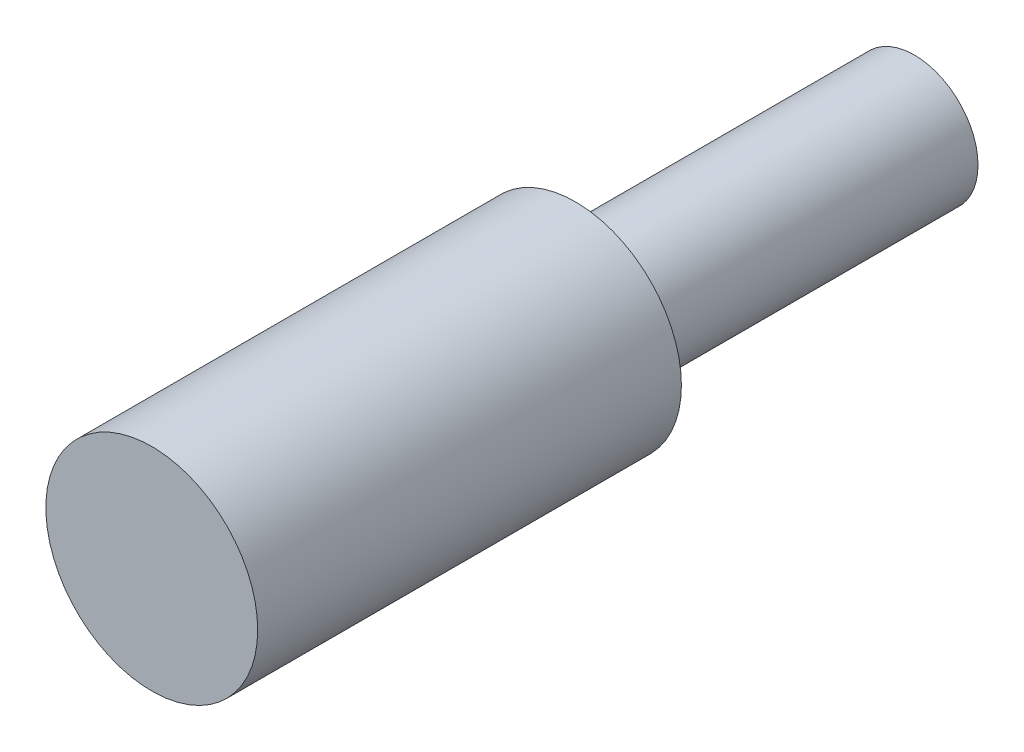
ISO-10303-21;
HEADER;
FILE_DESCRIPTION(('STEP AP214'),'2;1');
FILE_NAME('part.step','',(''),(''),'','','');
FILE_SCHEMA(('AUTOMOTIVE_DESIGN { 1 0 10303 214 1 1 1 1 }'));
ENDSEC;
DATA;
#1=APPLICATION_CONTEXT('core data for automotive mechanical design processes');
#2=APPLICATION_PROTOCOL_DEFINITION('international standard','automotive_design',2000,#1);
#3=PRODUCT_CONTEXT('',#1,'mechanical');
#4=PRODUCT('Part','Part','',(#3));
#5=PRODUCT_RELATED_PRODUCT_CATEGORY('part','',(#4));
#6=PRODUCT_DEFINITION_FORMATION('','',#4);
#7=PRODUCT_DEFINITION_CONTEXT('part definition',#1,'design');
#8=PRODUCT_DEFINITION('design','',#6,#7);
#9=PRODUCT_DEFINITION_SHAPE('','',#8);
#10=(LENGTH_UNIT() NAMED_UNIT(*) SI_UNIT(.MILLI.,.METRE.));
#11=(NAMED_UNIT(*) PLANE_ANGLE_UNIT() SI_UNIT($,.RADIAN.));
#12=(NAMED_UNIT(*) SI_UNIT($,.STERADIAN.) SOLID_ANGLE_UNIT());
#13=UNCERTAINTY_MEASURE_WITH_UNIT(LENGTH_MEASURE(1.E-05),#10,'distance_accuracy_value','');
#14=(GEOMETRIC_REPRESENTATION_CONTEXT(3) GLOBAL_UNCERTAINTY_ASSIGNED_CONTEXT((#13)) GLOBAL_UNIT_ASSIGNED_CONTEXT((#10,
#11,#12)) REPRESENTATION_CONTEXT('',''));
#15=CARTESIAN_POINT('',(0.,0.,0.));
#16=DIRECTION('',(0.,0.,1.));
#17=DIRECTION('',(1.,0.,0.));
#18=AXIS2_PLACEMENT_3D('',#15,#16,#17);
#19=CARTESIAN_POINT('',(0.,0.,100.));
#20=DIRECTION('',(0.,0.,-1.));
#21=DIRECTION('',(-1.,0.,0.));
#22=AXIS2_PLACEMENT_3D('',#19,#20,#21);
#23=CYLINDRICAL_SURFACE('',#22,25.);
#24=CARTESIAN_POINT('',(0.,0.,100.));
#25=DIRECTION('',(0.,0.,1.));
#26=DIRECTION('',(1.,0.,0.));
#27=AXIS2_PLACEMENT_3D('',#24,#25,#26);
#28=CIRCLE('',#27,25.);
#29=CARTESIAN_POINT('',(25.,0.,100.));
#30=VERTEX_POINT('',#29);
#31=EDGE_CURVE('E11',#30,#30,#28,.T.);
#32=ORIENTED_EDGE('',*,*,#31,.F.);
#33=EDGE_LOOP('',(#32));
#34=FACE_BOUND('',#33,.T.);
#35=CARTESIAN_POINT('',(0.,0.,0.));
#36=DIRECTION('',(0.,0.,1.));
#37=DIRECTION('',(1.,0.,0.));
#38=AXIS2_PLACEMENT_3D('',#35,#36,#37);
#39=CIRCLE('',#38,25.);
#40=CARTESIAN_POINT('',(25.,0.,0.));
#41=VERTEX_POINT('',#40);
#42=EDGE_CURVE('E43',#41,#41,#39,.T.);
#43=ORIENTED_EDGE('',*,*,#42,.T.);
#44=EDGE_LOOP('',(#43));
#45=FACE_BOUND('',#44,.T.);
#46=ADVANCED_FACE('F37',(#34,#45),#23,.T.);
#47=CARTESIAN_POINT('',(0.,0.,100.));
#48=DIRECTION('',(0.,0.,1.));
#49=DIRECTION('',(1.,0.,0.));
#50=AXIS2_PLACEMENT_3D('',#47,#48,#49);
#51=PLANE('',#50);
#52=ORIENTED_EDGE('',*,*,#31,.T.);
#53=EDGE_LOOP('',(#52));
#54=FACE_BOUND('',#53,.T.);
#55=ADVANCED_FACE('F137',(#54),#51,.T.);
#56=CARTESIAN_POINT('',(0.,0.,0.));
#57=DIRECTION('',(0.,0.,1.));
#58=DIRECTION('',(1.,0.,0.));
#59=AXIS2_PLACEMENT_3D('',#56,#57,#58);
#60=PLANE('',#59);
#61=CARTESIAN_POINT('',(0.,0.,0.));
#62=DIRECTION('',(0.,0.,1.));
#63=DIRECTION('',(1.,0.,0.));
#64=AXIS2_PLACEMENT_3D('',#61,#62,#63);
#65=CIRCLE('',#64,15.);
#66=CARTESIAN_POINT('',(15.,0.,0.));
#67=VERTEX_POINT('',#66);
#68=EDGE_CURVE('E119',#67,#67,#65,.T.);
#69=ORIENTED_EDGE('',*,*,#68,.T.);
#70=EDGE_LOOP('',(#69));
#71=FACE_BOUND('',#70,.T.);
#72=ORIENTED_EDGE('',*,*,#42,.F.);
#73=EDGE_LOOP('',(#72));
#74=FACE_BOUND('',#73,.T.);
#75=ADVANCED_FACE('F123',(#71,#74),#60,.F.);
#76=CARTESIAN_POINT('',(0.,0.,-80.));
#77=DIRECTION('',(0.,0.,1.));
#78=DIRECTION('',(1.,0.,0.));
#79=AXIS2_PLACEMENT_3D('',#76,#77,#78);
#80=CYLINDRICAL_SURFACE('',#79,15.);
#81=CARTESIAN_POINT('',(0.,0.,-80.));
#82=DIRECTION('',(0.,0.,1.));
#83=DIRECTION('',(1.,0.,0.));
#84=AXIS2_PLACEMENT_3D('',#81,#82,#83);
#85=CIRCLE('',#84,15.);
#86=CARTESIAN_POINT('',(15.,0.,-80.));
#87=VERTEX_POINT('',#86);
#88=EDGE_CURVE('E117',#87,#87,#85,.T.);
#89=ORIENTED_EDGE('',*,*,#88,.T.);
#90=EDGE_LOOP('',(#89));
#91=FACE_BOUND('',#90,.T.);
#92=ORIENTED_EDGE('',*,*,#68,.F.);
#93=EDGE_LOOP('',(#92));
#94=FACE_BOUND('',#93,.T.);
#95=ADVANCED_FACE('F130',(#91,#94),#80,.T.);
#96=CARTESIAN_POINT('',(0.,0.,-80.));
#97=DIRECTION('',(0.,0.,1.));
#98=DIRECTION('',(1.,0.,0.));
#99=AXIS2_PLACEMENT_3D('',#96,#97,#98);
#100=PLANE('',#99);
#101=ORIENTED_EDGE('',*,*,#88,.F.);
#102=EDGE_LOOP('',(#101));
#103=FACE_BOUND('',#102,.T.);
#104=ADVANCED_FACE('F129',(#103),#100,.F.);
#105=CLOSED_SHELL('',(#46,#55,#75,#95,#104));
#106=CARTESIAN_POINT('',(-4.,4.,50.));
#107=DIRECTION('',(1.,0.,0.));
#108=DIRECTION('',(0.,0.,-1.));
#109=AXIS2_PLACEMENT_3D('',#106,#107,#108);
#110=PLANE('',#109);
#111=DIRECTION('',(0.,0.,1.));
#112=VECTOR('',#111,1.);
#113=CARTESIAN_POINT('',(-4.,0.,50.));
#114=LINE('',#113,#112);
#115=CARTESIAN_POINT('',(-4.,0.,20.));
#116=VERTEX_POINT('',#115);
#117=CARTESIAN_POINT('',(-4.,0.,50.));
#118=VERTEX_POINT('',#117);
#119=EDGE_CURVE('E107',#116,#118,#114,.T.);
#120=ORIENTED_EDGE('',*,*,#119,.F.);
#121=DIRECTION('',(0.,-1.,0.));
#122=VECTOR('',#121,1.);
#123=CARTESIAN_POINT('',(-4.,4.,20.));
#124=LINE('',#123,#122);
#125=CARTESIAN_POINT('',(-4.,4.,20.));
#126=VERTEX_POINT('',#125);
#127=EDGE_CURVE('E102',#126,#116,#124,.T.);
#128=ORIENTED_EDGE('',*,*,#127,.F.);
#129=DIRECTION('',(0.,0.,1.));
#130=VECTOR('',#129,1.);
#131=CARTESIAN_POINT('',(-4.,4.,50.));
#132=LINE('',#131,#130);
#133=CARTESIAN_POINT('',(-4.,4.,50.));
#134=VERTEX_POINT('',#133);
#135=EDGE_CURVE('E96',#126,#134,#132,.T.);
#136=ORIENTED_EDGE('',*,*,#135,.T.);
#137=DIRECTION('',(0.,-1.,0.));
#138=VECTOR('',#137,1.);
#139=CARTESIAN_POINT('',(-4.,4.,50.));
#140=LINE('',#139,#138);
#141=EDGE_CURVE('E94',#134,#118,#140,.T.);
#142=ORIENTED_EDGE('',*,*,#141,.T.);
#143=EDGE_LOOP('',(#120,#128,#136,#142));
#144=FACE_BOUND('',#143,.T.);
#145=ADVANCED_FACE('F175',(#144),#110,.T.);
#146=CARTESIAN_POINT('',(-4.,4.,50.));
#147=DIRECTION('',(0.,0.,-1.));
#148=DIRECTION('',(-1.,0.,0.));
#149=AXIS2_PLACEMENT_3D('',#146,#147,#148);
#150=PLANE('',#149);
#151=DIRECTION('',(1.,0.,0.));
#152=VECTOR('',#151,1.);
#153=CARTESIAN_POINT('',(-4.,0.,50.));
#154=LINE('',#153,#152);
#155=CARTESIAN_POINT('',(4.,0.,50.));
#156=VERTEX_POINT('',#155);
#157=EDGE_CURVE('E109',#118,#156,#154,.T.);
#158=ORIENTED_EDGE('',*,*,#157,.F.);
#159=ORIENTED_EDGE('',*,*,#141,.F.);
#160=DIRECTION('',(1.,0.,0.));
#161=VECTOR('',#160,1.);
#162=CARTESIAN_POINT('',(-4.,4.,50.));
#163=LINE('',#162,#161);
#164=CARTESIAN_POINT('',(4.,4.,50.));
#165=VERTEX_POINT('',#164);
#166=EDGE_CURVE('E84',#134,#165,#163,.T.);
#167=ORIENTED_EDGE('',*,*,#166,.T.);
#168=DIRECTION('',(0.,-1.,0.));
#169=VECTOR('',#168,1.);
#170=CARTESIAN_POINT('',(4.,4.,50.));
#171=LINE('',#170,#169);
#172=EDGE_CURVE('E95',#165,#156,#171,.T.);
#173=ORIENTED_EDGE('',*,*,#172,.T.);
#174=EDGE_LOOP('',(#158,#159,#167,#173));
#175=FACE_BOUND('',#174,.T.);
#176=ADVANCED_FACE('F93',(#175),#150,.T.);
#177=CARTESIAN_POINT('',(4.,4.,50.));
#178=DIRECTION('',(-1.,0.,0.));
#179=DIRECTION('',(0.,0.,1.));
#180=AXIS2_PLACEMENT_3D('',#177,#178,#179);
#181=PLANE('',#180);
#182=DIRECTION('',(0.,0.,-1.));
#183=VECTOR('',#182,1.);
#184=CARTESIAN_POINT('',(4.,0.,50.));
#185=LINE('',#184,#183);
#186=CARTESIAN_POINT('',(4.,0.,20.));
#187=VERTEX_POINT('',#186);
#188=EDGE_CURVE('E71',#156,#187,#185,.T.);
#189=ORIENTED_EDGE('',*,*,#188,.F.);
#190=ORIENTED_EDGE('',*,*,#172,.F.);
#191=DIRECTION('',(0.,0.,-1.));
#192=VECTOR('',#191,1.);
#193=CARTESIAN_POINT('',(4.,4.,50.));
#194=LINE('',#193,#192);
#195=CARTESIAN_POINT('',(4.,4.,20.));
#196=VERTEX_POINT('',#195);
#197=EDGE_CURVE('E92',#165,#196,#194,.T.);
#198=ORIENTED_EDGE('',*,*,#197,.T.);
#199=DIRECTION('',(0.,-1.,0.));
#200=VECTOR('',#199,1.);
#201=CARTESIAN_POINT('',(4.,4.,20.));
#202=LINE('',#201,#200);
#203=EDGE_CURVE('E99',#196,#187,#202,.T.);
#204=ORIENTED_EDGE('',*,*,#203,.T.);
#205=EDGE_LOOP('',(#189,#190,#198,#204));
#206=FACE_BOUND('',#205,.T.);
#207=ADVANCED_FACE('F97',(#206),#181,.T.);
#208=CARTESIAN_POINT('',(-4.,4.,20.));
#209=DIRECTION('',(0.,0.,1.));
#210=DIRECTION('',(1.,0.,0.));
#211=AXIS2_PLACEMENT_3D('',#208,#209,#210);
#212=PLANE('',#211);
#213=DIRECTION('',(-1.,0.,0.));
#214=VECTOR('',#213,1.);
#215=CARTESIAN_POINT('',(-4.,0.,20.));
#216=LINE('',#215,#214);
#217=EDGE_CURVE('E77',#187,#116,#216,.T.);
#218=ORIENTED_EDGE('',*,*,#217,.F.);
#219=ORIENTED_EDGE('',*,*,#203,.F.);
#220=DIRECTION('',(-1.,0.,0.));
#221=VECTOR('',#220,1.);
#222=CARTESIAN_POINT('',(-4.,4.,20.));
#223=LINE('',#222,#221);
#224=EDGE_CURVE('E57',#196,#126,#223,.T.);
#225=ORIENTED_EDGE('',*,*,#224,.T.);
#226=ORIENTED_EDGE('',*,*,#127,.T.);
#227=EDGE_LOOP('',(#218,#219,#225,#226));
#228=FACE_BOUND('',#227,.T.);
#229=ADVANCED_FACE('F198',(#228),#212,.T.);
#230=CARTESIAN_POINT('',(0.,4.,0.));
#231=DIRECTION('',(0.,-1.,0.));
#232=DIRECTION('',(0.,0.,-1.));
#233=AXIS2_PLACEMENT_3D('',#230,#231,#232);
#234=PLANE('',#233);
#235=ORIENTED_EDGE('',*,*,#135,.F.);
#236=ORIENTED_EDGE('',*,*,#224,.F.);
#237=ORIENTED_EDGE('',*,*,#197,.F.);
#238=ORIENTED_EDGE('',*,*,#166,.F.);
#239=EDGE_LOOP('',(#235,#236,#237,#238));
#240=FACE_BOUND('',#239,.T.);
#241=ADVANCED_FACE('F105',(#240),#234,.T.);
#242=CARTESIAN_POINT('',(0.,0.,0.));
#243=DIRECTION('',(0.,-1.,0.));
#244=DIRECTION('',(0.,0.,-1.));
#245=AXIS2_PLACEMENT_3D('',#242,#243,#244);
#246=PLANE('',#245);
#247=ORIENTED_EDGE('',*,*,#119,.T.);
#248=ORIENTED_EDGE('',*,*,#157,.T.);
#249=ORIENTED_EDGE('',*,*,#188,.T.);
#250=ORIENTED_EDGE('',*,*,#217,.T.);
#251=EDGE_LOOP('',(#247,#248,#249,#250));
#252=FACE_BOUND('',#251,.T.);
#253=ADVANCED_FACE('F213',(#252),#246,.F.);
#254=CLOSED_SHELL('',(#145,#176,#207,#229,#241,#253));
#255=ORIENTED_CLOSED_SHELL('',*,#105,.T.);
#256=BREP_WITH_VOIDS('B2',#254,(#255));
#257=ADVANCED_BREP_SHAPE_REPRESENTATION('',(#18,#256),#14);
#258=SHAPE_DEFINITION_REPRESENTATION(#9,#257);
ENDSEC;
END-ISO-10303-21;
